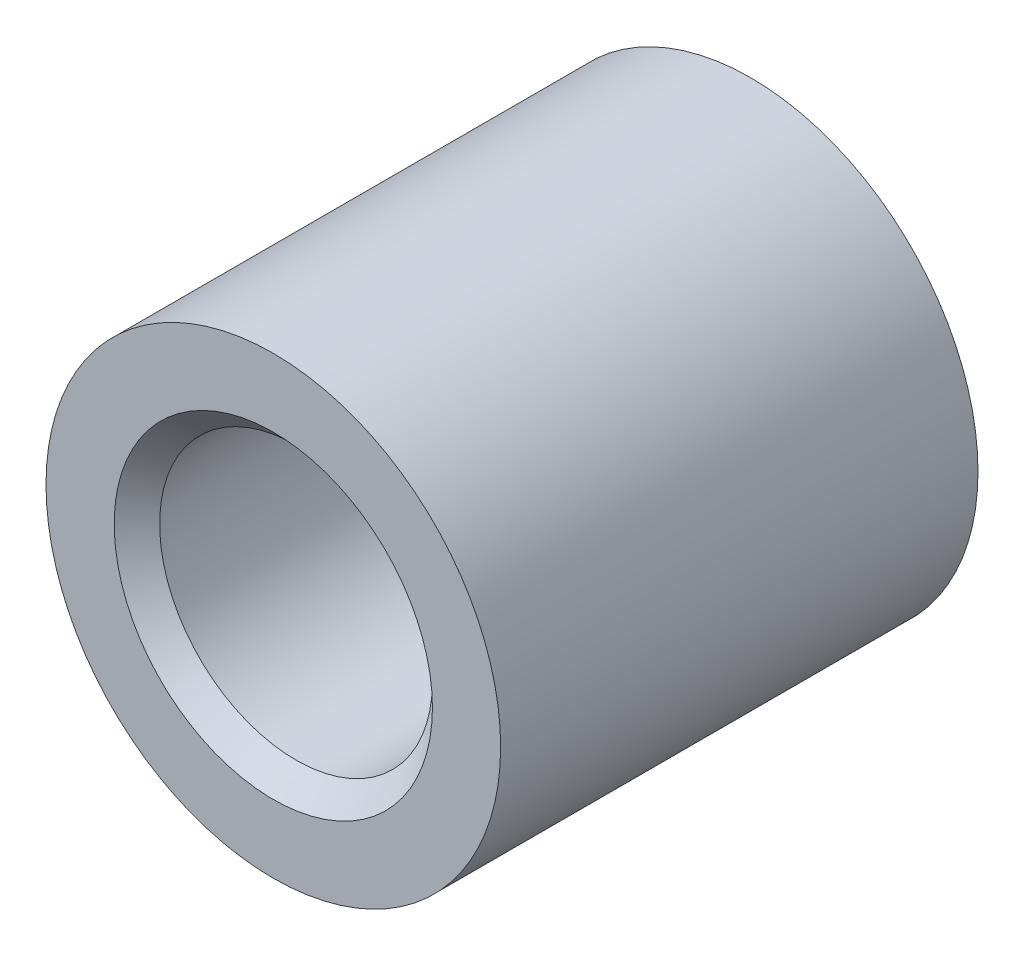
ISO-10303-21;
HEADER;
FILE_DESCRIPTION(('STEP AP214'),'2;1');
FILE_NAME('part.step','',(''),(''),'','','');
FILE_SCHEMA(('AUTOMOTIVE_DESIGN { 1 0 10303 214 1 1 1 1 }'));
ENDSEC;
DATA;
#1=APPLICATION_CONTEXT('core data for automotive mechanical design processes');
#2=APPLICATION_PROTOCOL_DEFINITION('international standard','automotive_design',2000,#1);
#3=PRODUCT_CONTEXT('',#1,'mechanical');
#4=PRODUCT('Part','Part','',(#3));
#5=PRODUCT_RELATED_PRODUCT_CATEGORY('part','',(#4));
#6=PRODUCT_DEFINITION_FORMATION('','',#4);
#7=PRODUCT_DEFINITION_CONTEXT('part definition',#1,'design');
#8=PRODUCT_DEFINITION('design','',#6,#7);
#9=PRODUCT_DEFINITION_SHAPE('','',#8);
#10=(LENGTH_UNIT() NAMED_UNIT(*) SI_UNIT(.MILLI.,.METRE.));
#11=(NAMED_UNIT(*) PLANE_ANGLE_UNIT() SI_UNIT($,.RADIAN.));
#12=(NAMED_UNIT(*) SI_UNIT($,.STERADIAN.) SOLID_ANGLE_UNIT());
#13=UNCERTAINTY_MEASURE_WITH_UNIT(LENGTH_MEASURE(1.E-05),#10,'distance_accuracy_value','');
#14=(GEOMETRIC_REPRESENTATION_CONTEXT(3) GLOBAL_UNCERTAINTY_ASSIGNED_CONTEXT((#13)) GLOBAL_UNIT_ASSIGNED_CONTEXT((#10,
#11,#12)) REPRESENTATION_CONTEXT('',''));
#15=CARTESIAN_POINT('',(0.,0.,0.));
#16=DIRECTION('',(0.,0.,1.));
#17=DIRECTION('',(1.,0.,0.));
#18=AXIS2_PLACEMENT_3D('',#15,#16,#17);
#19=CARTESIAN_POINT('',(0.,2.,-0.800000000026557));
#20=DIRECTION('',(0.,0.,1.));
#21=DIRECTION('',(1.,0.,0.));
#22=AXIS2_PLACEMENT_3D('',#19,#20,#21);
#23=CONICAL_SURFACE('',#22,1.40000000004647,0.785398163397448);
#24=CARTESIAN_POINT('',(0.,2.,-0.800000000026557));
#25=DIRECTION('',(0.,0.,1.));
#26=DIRECTION('',(1.,0.,0.));
#27=AXIS2_PLACEMENT_3D('',#24,#25,#26);
#28=CIRCLE('',#27,1.40000000004647);
#29=CARTESIAN_POINT('',(1.40000000004648,2.,-0.800000000026557));
#30=VERTEX_POINT('',#29);
#31=EDGE_CURVE('E17',#30,#30,#28,.F.);
#32=ORIENTED_EDGE('',*,*,#31,.F.);
#33=EDGE_LOOP('',(#32));
#34=FACE_BOUND('',#33,.T.);
#35=CARTESIAN_POINT('',(0.,2.,-1.));
#36=DIRECTION('',(0.,0.,1.));
#37=DIRECTION('',(1.,0.,0.));
#38=AXIS2_PLACEMENT_3D('',#35,#36,#37);
#39=CIRCLE('',#38,1.2);
#40=CARTESIAN_POINT('',(1.2,2.,-1.));
#41=VERTEX_POINT('',#40);
#42=EDGE_CURVE('E35',#41,#41,#39,.F.);
#43=ORIENTED_EDGE('',*,*,#42,.T.);
#44=EDGE_LOOP('',(#43));
#45=FACE_BOUND('',#44,.T.);
#46=ADVANCED_FACE('F14',(#34,#45),#23,.F.);
#47=CARTESIAN_POINT('',(0.,2.,-5.));
#48=DIRECTION('',(0.,0.,1.));
#49=DIRECTION('',(1.,0.,0.));
#50=AXIS2_PLACEMENT_3D('',#47,#48,#49);
#51=CYLINDRICAL_SURFACE('',#50,1.2);
#52=CARTESIAN_POINT('',(0.,2.,-5.));
#53=DIRECTION('',(0.,0.,1.));
#54=DIRECTION('',(1.,0.,0.));
#55=AXIS2_PLACEMENT_3D('',#52,#53,#54);
#56=CIRCLE('',#55,1.2);
#57=CARTESIAN_POINT('',(1.2,2.,-5.));
#58=VERTEX_POINT('',#57);
#59=EDGE_CURVE('E26',#58,#58,#56,.F.);
#60=ORIENTED_EDGE('',*,*,#59,.T.);
#61=EDGE_LOOP('',(#60));
#62=FACE_BOUND('',#61,.T.);
#63=ORIENTED_EDGE('',*,*,#42,.F.);
#64=EDGE_LOOP('',(#63));
#65=FACE_BOUND('',#64,.T.);
#66=ADVANCED_FACE('F42',(#62,#65),#51,.F.);
#67=CARTESIAN_POINT('',(0.,2.,-0.8));
#68=DIRECTION('',(0.,0.,1.));
#69=DIRECTION('',(1.,0.,0.));
#70=AXIS2_PLACEMENT_3D('',#67,#68,#69);
#71=PLANE('',#70);
#72=CARTESIAN_POINT('',(0.,2.,-0.8));
#73=DIRECTION('',(0.,0.,-1.));
#74=DIRECTION('',(-1.,0.,0.));
#75=AXIS2_PLACEMENT_3D('',#72,#73,#74);
#76=CIRCLE('',#75,2.);
#77=CARTESIAN_POINT('',(-2.,2.,-0.8));
#78=VERTEX_POINT('',#77);
#79=EDGE_CURVE('E21',#78,#78,#76,.T.);
#80=ORIENTED_EDGE('',*,*,#79,.F.);
#81=EDGE_LOOP('',(#80));
#82=FACE_BOUND('',#81,.T.);
#83=ORIENTED_EDGE('',*,*,#31,.T.);
#84=EDGE_LOOP('',(#83));
#85=FACE_BOUND('',#84,.T.);
#86=ADVANCED_FACE('F44',(#82,#85),#71,.T.);
#87=CARTESIAN_POINT('',(0.,2.,-5.));
#88=DIRECTION('',(0.,0.,1.));
#89=DIRECTION('',(1.,0.,0.));
#90=AXIS2_PLACEMENT_3D('',#87,#88,#89);
#91=PLANE('',#90);
#92=CARTESIAN_POINT('',(0.,2.,-5.));
#93=DIRECTION('',(0.,0.,-1.));
#94=DIRECTION('',(-1.,0.,0.));
#95=AXIS2_PLACEMENT_3D('',#92,#93,#94);
#96=CIRCLE('',#95,2.);
#97=CARTESIAN_POINT('',(-2.,2.,-5.));
#98=VERTEX_POINT('',#97);
#99=EDGE_CURVE('E10',#98,#98,#96,.F.);
#100=ORIENTED_EDGE('',*,*,#99,.F.);
#101=EDGE_LOOP('',(#100));
#102=FACE_BOUND('',#101,.T.);
#103=ORIENTED_EDGE('',*,*,#59,.F.);
#104=EDGE_LOOP('',(#103));
#105=FACE_BOUND('',#104,.T.);
#106=ADVANCED_FACE('F50',(#102,#105),#91,.F.);
#107=CARTESIAN_POINT('',(0.,2.,-0.8));
#108=DIRECTION('',(0.,0.,-1.));
#109=DIRECTION('',(-1.,0.,0.));
#110=AXIS2_PLACEMENT_3D('',#107,#108,#109);
#111=CYLINDRICAL_SURFACE('',#110,2.);
#112=ORIENTED_EDGE('',*,*,#99,.T.);
#113=EDGE_LOOP('',(#112));
#114=FACE_BOUND('',#113,.T.);
#115=ORIENTED_EDGE('',*,*,#79,.T.);
#116=EDGE_LOOP('',(#115));
#117=FACE_BOUND('',#116,.T.);
#118=ADVANCED_FACE('F54',(#114,#117),#111,.T.);
#119=CLOSED_SHELL('',(#46,#66,#86,#106,#118));
#120=MANIFOLD_SOLID_BREP('B1',#119);
#121=ADVANCED_BREP_SHAPE_REPRESENTATION('',(#18,#120),#14);
#122=SHAPE_DEFINITION_REPRESENTATION(#9,#121);
ENDSEC;
END-ISO-10303-21;
